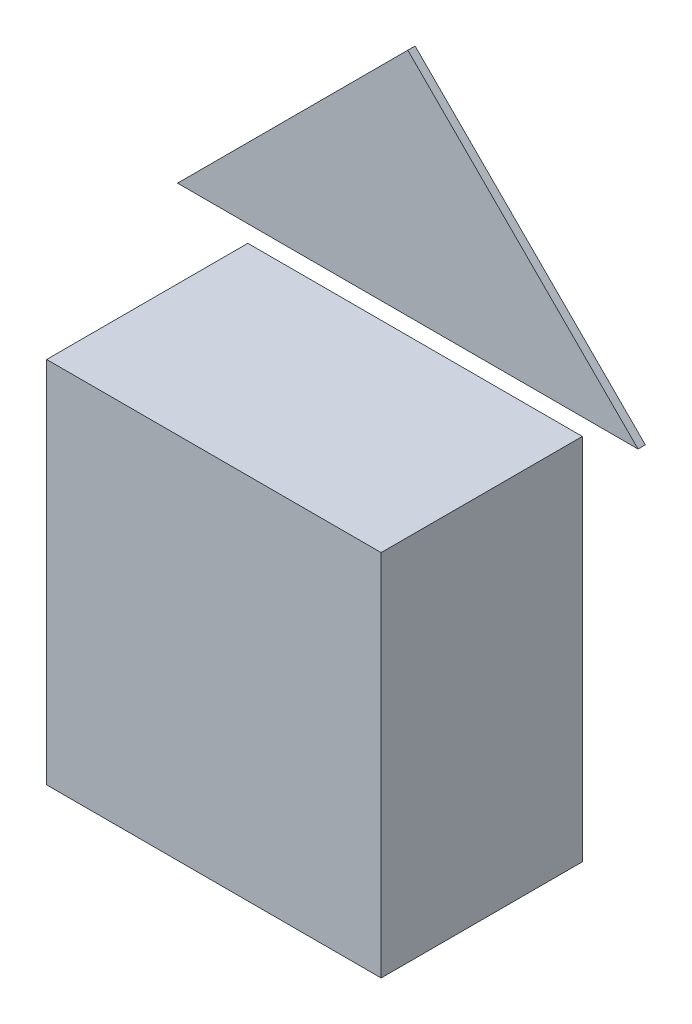
ISO-10303-21;
HEADER;
FILE_DESCRIPTION(('STEP AP214'),'2;1');
FILE_NAME('part.step','',(''),(''),'','','');
FILE_SCHEMA(('AUTOMOTIVE_DESIGN { 1 0 10303 214 1 1 1 1 }'));
ENDSEC;
DATA;
#1=APPLICATION_CONTEXT('core data for automotive mechanical design processes');
#2=APPLICATION_PROTOCOL_DEFINITION('international standard','automotive_design',2000,#1);
#3=PRODUCT_CONTEXT('',#1,'mechanical');
#4=PRODUCT('Part','Part','',(#3));
#5=PRODUCT_RELATED_PRODUCT_CATEGORY('part','',(#4));
#6=PRODUCT_DEFINITION_FORMATION('','',#4);
#7=PRODUCT_DEFINITION_CONTEXT('part definition',#1,'design');
#8=PRODUCT_DEFINITION('design','',#6,#7);
#9=PRODUCT_DEFINITION_SHAPE('','',#8);
#10=(LENGTH_UNIT() NAMED_UNIT(*) SI_UNIT(.MILLI.,.METRE.));
#11=(NAMED_UNIT(*) PLANE_ANGLE_UNIT() SI_UNIT($,.RADIAN.));
#12=(NAMED_UNIT(*) SI_UNIT($,.STERADIAN.) SOLID_ANGLE_UNIT());
#13=UNCERTAINTY_MEASURE_WITH_UNIT(LENGTH_MEASURE(1.E-05),#10,'distance_accuracy_value','');
#14=(GEOMETRIC_REPRESENTATION_CONTEXT(3) GLOBAL_UNCERTAINTY_ASSIGNED_CONTEXT((#13)) GLOBAL_UNIT_ASSIGNED_CONTEXT((#10,
#11,#12)) REPRESENTATION_CONTEXT('',''));
#15=CARTESIAN_POINT('',(0.,0.,0.));
#16=DIRECTION('',(0.,0.,1.));
#17=DIRECTION('',(1.,0.,0.));
#18=AXIS2_PLACEMENT_3D('',#15,#16,#17);
#19=CARTESIAN_POINT('',(973.262557024016,882.440801129921,30.));
#20=DIRECTION('',(-0.707106781186551,-0.707106781186544,0.));
#21=DIRECTION('',(0.707106781186544,-0.707106781186551,0.));
#22=AXIS2_PLACEMENT_3D('',#19,#20,#21);
#23=PLANE('',#22);
#24=DIRECTION('',(-0.707106781186544,0.707106781186551,0.));
#25=VECTOR('',#24,1.);
#26=CARTESIAN_POINT('',(973.262557024016,882.440801129921,0.));
#27=LINE('',#26,#25);
#28=CARTESIAN_POINT('',(973.262557024016,882.440801129921,0.));
#29=VERTEX_POINT('',#28);
#30=CARTESIAN_POINT('',(23.262557024026,1832.44080112992,0.));
#31=VERTEX_POINT('',#30);
#32=EDGE_CURVE('E99',#29,#31,#27,.T.);
#33=ORIENTED_EDGE('',*,*,#32,.T.);
#34=DIRECTION('',(0.,0.,-1.));
#35=VECTOR('',#34,1.);
#36=CARTESIAN_POINT('',(23.262557024026,1832.44080112992,30.));
#37=LINE('',#36,#35);
#38=CARTESIAN_POINT('',(23.262557024026,1832.44080112992,30.));
#39=VERTEX_POINT('',#38);
#40=EDGE_CURVE('E12',#39,#31,#37,.T.);
#41=ORIENTED_EDGE('',*,*,#40,.F.);
#42=DIRECTION('',(-0.707106781186544,0.707106781186551,0.));
#43=VECTOR('',#42,1.);
#44=CARTESIAN_POINT('',(973.262557024016,882.440801129921,30.));
#45=LINE('',#44,#43);
#46=CARTESIAN_POINT('',(973.262557024016,882.440801129921,30.));
#47=VERTEX_POINT('',#46);
#48=EDGE_CURVE('E92',#47,#39,#45,.T.);
#49=ORIENTED_EDGE('',*,*,#48,.F.);
#50=DIRECTION('',(0.,0.,-1.));
#51=VECTOR('',#50,1.);
#52=CARTESIAN_POINT('',(973.262557024016,882.440801129921,30.));
#53=LINE('',#52,#51);
#54=EDGE_CURVE('E100',#47,#29,#53,.T.);
#55=ORIENTED_EDGE('',*,*,#54,.T.);
#56=EDGE_LOOP('',(#33,#41,#49,#55));
#57=FACE_BOUND('',#56,.T.);
#58=ADVANCED_FACE('F52',(#57),#23,.F.);
#59=CARTESIAN_POINT('',(23.262557024026,1832.44080112992,30.));
#60=DIRECTION('',(0.707106781186544,-0.707106781186551,0.));
#61=DIRECTION('',(0.707106781186551,0.707106781186544,0.));
#62=AXIS2_PLACEMENT_3D('',#59,#60,#61);
#63=PLANE('',#62);
#64=DIRECTION('',(-0.707106781186551,-0.707106781186544,0.));
#65=VECTOR('',#64,1.);
#66=CARTESIAN_POINT('',(23.262557024026,1832.44080112992,0.));
#67=LINE('',#66,#65);
#68=CARTESIAN_POINT('',(-926.737442975983,882.440801129921,0.));
#69=VERTEX_POINT('',#68);
#70=EDGE_CURVE('E80',#31,#69,#67,.T.);
#71=ORIENTED_EDGE('',*,*,#70,.T.);
#72=DIRECTION('',(0.,0.,-1.));
#73=VECTOR('',#72,1.);
#74=CARTESIAN_POINT('',(-926.737442975983,882.440801129921,30.));
#75=LINE('',#74,#73);
#76=CARTESIAN_POINT('',(-926.737442975983,882.440801129921,30.));
#77=VERTEX_POINT('',#76);
#78=EDGE_CURVE('E60',#77,#69,#75,.T.);
#79=ORIENTED_EDGE('',*,*,#78,.F.);
#80=DIRECTION('',(-0.707106781186551,-0.707106781186544,0.));
#81=VECTOR('',#80,1.);
#82=CARTESIAN_POINT('',(23.262557024026,1832.44080112992,30.));
#83=LINE('',#82,#81);
#84=EDGE_CURVE('E88',#39,#77,#83,.T.);
#85=ORIENTED_EDGE('',*,*,#84,.F.);
#86=ORIENTED_EDGE('',*,*,#40,.T.);
#87=EDGE_LOOP('',(#71,#79,#85,#86));
#88=FACE_BOUND('',#87,.T.);
#89=ADVANCED_FACE('F89',(#88),#63,.F.);
#90=CARTESIAN_POINT('',(-926.737442975983,882.440801129921,30.));
#91=DIRECTION('',(0.,1.,0.));
#92=DIRECTION('',(-1.,0.,0.));
#93=AXIS2_PLACEMENT_3D('',#90,#91,#92);
#94=PLANE('',#93);
#95=DIRECTION('',(1.,0.,0.));
#96=VECTOR('',#95,1.);
#97=CARTESIAN_POINT('',(-926.737442975983,882.440801129921,0.));
#98=LINE('',#97,#96);
#99=EDGE_CURVE('E85',#69,#29,#98,.T.);
#100=ORIENTED_EDGE('',*,*,#99,.T.);
#101=ORIENTED_EDGE('',*,*,#54,.F.);
#102=DIRECTION('',(1.,0.,0.));
#103=VECTOR('',#102,1.);
#104=CARTESIAN_POINT('',(-926.737442975983,882.440801129921,30.));
#105=LINE('',#104,#103);
#106=EDGE_CURVE('E68',#77,#47,#105,.T.);
#107=ORIENTED_EDGE('',*,*,#106,.F.);
#108=ORIENTED_EDGE('',*,*,#78,.T.);
#109=EDGE_LOOP('',(#100,#101,#107,#108));
#110=FACE_BOUND('',#109,.T.);
#111=ADVANCED_FACE('F107',(#110),#94,.F.);
#112=CARTESIAN_POINT('',(0.,0.,30.));
#113=DIRECTION('',(0.,0.,1.));
#114=DIRECTION('',(1.,0.,0.));
#115=AXIS2_PLACEMENT_3D('',#112,#113,#114);
#116=PLANE('',#115);
#117=ORIENTED_EDGE('',*,*,#48,.T.);
#118=ORIENTED_EDGE('',*,*,#84,.T.);
#119=ORIENTED_EDGE('',*,*,#106,.T.);
#120=EDGE_LOOP('',(#117,#118,#119));
#121=FACE_BOUND('',#120,.T.);
#122=ADVANCED_FACE('F95',(#121),#116,.T.);
#123=CARTESIAN_POINT('',(0.,0.,0.));
#124=DIRECTION('',(0.,0.,1.));
#125=DIRECTION('',(1.,0.,0.));
#126=AXIS2_PLACEMENT_3D('',#123,#124,#125);
#127=PLANE('',#126);
#128=ORIENTED_EDGE('',*,*,#32,.F.);
#129=ORIENTED_EDGE('',*,*,#99,.F.);
#130=ORIENTED_EDGE('',*,*,#70,.F.);
#131=EDGE_LOOP('',(#128,#129,#130));
#132=FACE_BOUND('',#131,.T.);
#133=ADVANCED_FACE('F108',(#132),#127,.F.);
#134=CLOSED_SHELL('',(#58,#89,#111,#122,#133));
#135=MANIFOLD_SOLID_BREP('B2',#134);
#136=CARTESIAN_POINT('',(-666.737442975974,782.440801129921,830.));
#137=DIRECTION('',(0.,1.,0.));
#138=DIRECTION('',(-1.,0.,0.));
#139=AXIS2_PLACEMENT_3D('',#136,#137,#138);
#140=PLANE('',#139);
#141=DIRECTION('',(1.,0.,0.));
#142=VECTOR('',#141,1.);
#143=CARTESIAN_POINT('',(-666.737442975974,782.440801129921,0.));
#144=LINE('',#143,#142);
#145=CARTESIAN_POINT('',(-666.737442975974,782.440801129921,0.));
#146=VERTEX_POINT('',#145);
#147=CARTESIAN_POINT('',(713.262557024026,782.440801129921,0.));
#148=VERTEX_POINT('',#147);
#149=EDGE_CURVE('E230',#146,#148,#144,.T.);
#150=ORIENTED_EDGE('',*,*,#149,.F.);
#151=DIRECTION('',(0.,0.,-1.));
#152=VECTOR('',#151,1.);
#153=CARTESIAN_POINT('',(-666.737442975974,782.440801129921,830.));
#154=LINE('',#153,#152);
#155=CARTESIAN_POINT('',(-666.737442975974,782.440801129921,830.));
#156=VERTEX_POINT('',#155);
#157=EDGE_CURVE('E50',#156,#146,#154,.T.);
#158=ORIENTED_EDGE('',*,*,#157,.F.);
#159=DIRECTION('',(1.,0.,0.));
#160=VECTOR('',#159,1.);
#161=CARTESIAN_POINT('',(-666.737442975974,782.440801129921,830.));
#162=LINE('',#161,#160);
#163=CARTESIAN_POINT('',(713.262557024026,782.440801129921,830.));
#164=VERTEX_POINT('',#163);
#165=EDGE_CURVE('E223',#156,#164,#162,.T.);
#166=ORIENTED_EDGE('',*,*,#165,.T.);
#167=DIRECTION('',(0.,0.,-1.));
#168=VECTOR('',#167,1.);
#169=CARTESIAN_POINT('',(713.262557024026,782.440801129921,830.));
#170=LINE('',#169,#168);
#171=EDGE_CURVE('E162',#164,#148,#170,.T.);
#172=ORIENTED_EDGE('',*,*,#171,.T.);
#173=EDGE_LOOP('',(#150,#158,#166,#172));
#174=FACE_BOUND('',#173,.T.);
#175=ADVANCED_FACE('F159',(#174),#140,.T.);
#176=CARTESIAN_POINT('',(-666.737442975974,782.440801129921,830.));
#177=DIRECTION('',(1.,0.,0.));
#178=DIRECTION('',(0.,1.,0.));
#179=AXIS2_PLACEMENT_3D('',#176,#177,#178);
#180=PLANE('',#179);
#181=DIRECTION('',(0.,-1.,0.));
#182=VECTOR('',#181,1.);
#183=CARTESIAN_POINT('',(-666.737442975974,782.440801129921,0.));
#184=LINE('',#183,#182);
#185=CARTESIAN_POINT('',(-666.737442975974,-737.559198870079,0.));
#186=VERTEX_POINT('',#185);
#187=EDGE_CURVE('E193',#146,#186,#184,.T.);
#188=ORIENTED_EDGE('',*,*,#187,.T.);
#189=DIRECTION('',(0.,0.,-1.));
#190=VECTOR('',#189,1.);
#191=CARTESIAN_POINT('',(-666.737442975974,-737.559198870079,830.));
#192=LINE('',#191,#190);
#193=CARTESIAN_POINT('',(-666.737442975974,-737.559198870079,830.));
#194=VERTEX_POINT('',#193);
#195=EDGE_CURVE('E169',#194,#186,#192,.T.);
#196=ORIENTED_EDGE('',*,*,#195,.F.);
#197=DIRECTION('',(0.,-1.,0.));
#198=VECTOR('',#197,1.);
#199=CARTESIAN_POINT('',(-666.737442975974,782.440801129921,830.));
#200=LINE('',#199,#198);
#201=EDGE_CURVE('E210',#156,#194,#200,.T.);
#202=ORIENTED_EDGE('',*,*,#201,.F.);
#203=ORIENTED_EDGE('',*,*,#157,.T.);
#204=EDGE_LOOP('',(#188,#196,#202,#203));
#205=FACE_BOUND('',#204,.T.);
#206=ADVANCED_FACE('F246',(#205),#180,.F.);
#207=CARTESIAN_POINT('',(-666.737442975974,-737.559198870079,830.));
#208=DIRECTION('',(0.,1.,0.));
#209=DIRECTION('',(0.,0.,1.));
#210=AXIS2_PLACEMENT_3D('',#207,#208,#209);
#211=PLANE('',#210);
#212=DIRECTION('',(1.,0.,0.));
#213=VECTOR('',#212,1.);
#214=CARTESIAN_POINT('',(-666.737442975974,-737.559198870079,0.));
#215=LINE('',#214,#213);
#216=CARTESIAN_POINT('',(713.262557024026,-737.559198870079,0.));
#217=VERTEX_POINT('',#216);
#218=EDGE_CURVE('E218',#186,#217,#215,.T.);
#219=ORIENTED_EDGE('',*,*,#218,.T.);
#220=DIRECTION('',(0.,0.,-1.));
#221=VECTOR('',#220,1.);
#222=CARTESIAN_POINT('',(713.262557024026,-737.559198870079,830.));
#223=LINE('',#222,#221);
#224=CARTESIAN_POINT('',(713.262557024026,-737.559198870079,830.));
#225=VERTEX_POINT('',#224);
#226=EDGE_CURVE('E215',#225,#217,#223,.T.);
#227=ORIENTED_EDGE('',*,*,#226,.F.);
#228=DIRECTION('',(1.,0.,0.));
#229=VECTOR('',#228,1.);
#230=CARTESIAN_POINT('',(-666.737442975974,-737.559198870079,830.));
#231=LINE('',#230,#229);
#232=EDGE_CURVE('E205',#194,#225,#231,.T.);
#233=ORIENTED_EDGE('',*,*,#232,.F.);
#234=ORIENTED_EDGE('',*,*,#195,.T.);
#235=EDGE_LOOP('',(#219,#227,#233,#234));
#236=FACE_BOUND('',#235,.T.);
#237=ADVANCED_FACE('F216',(#236),#211,.F.);
#238=CARTESIAN_POINT('',(713.262557024026,782.440801129921,830.));
#239=DIRECTION('',(1.,0.,0.));
#240=DIRECTION('',(0.,1.,0.));
#241=AXIS2_PLACEMENT_3D('',#238,#239,#240);
#242=PLANE('',#241);
#243=DIRECTION('',(0.,-1.,0.));
#244=VECTOR('',#243,1.);
#245=CARTESIAN_POINT('',(713.262557024026,782.440801129921,0.));
#246=LINE('',#245,#244);
#247=EDGE_CURVE('E234',#148,#217,#246,.T.);
#248=ORIENTED_EDGE('',*,*,#247,.F.);
#249=ORIENTED_EDGE('',*,*,#171,.F.);
#250=DIRECTION('',(0.,-1.,0.));
#251=VECTOR('',#250,1.);
#252=CARTESIAN_POINT('',(713.262557024026,782.440801129921,830.));
#253=LINE('',#252,#251);
#254=EDGE_CURVE('E209',#164,#225,#253,.T.);
#255=ORIENTED_EDGE('',*,*,#254,.T.);
#256=ORIENTED_EDGE('',*,*,#226,.T.);
#257=EDGE_LOOP('',(#248,#249,#255,#256));
#258=FACE_BOUND('',#257,.T.);
#259=ADVANCED_FACE('F221',(#258),#242,.T.);
#260=CARTESIAN_POINT('',(0.,0.,830.));
#261=DIRECTION('',(0.,0.,-1.));
#262=DIRECTION('',(-1.,0.,0.));
#263=AXIS2_PLACEMENT_3D('',#260,#261,#262);
#264=PLANE('',#263);
#265=ORIENTED_EDGE('',*,*,#165,.F.);
#266=ORIENTED_EDGE('',*,*,#201,.T.);
#267=ORIENTED_EDGE('',*,*,#232,.T.);
#268=ORIENTED_EDGE('',*,*,#254,.F.);
#269=EDGE_LOOP('',(#265,#266,#267,#268));
#270=FACE_BOUND('',#269,.T.);
#271=ADVANCED_FACE('F208',(#270),#264,.F.);
#272=CARTESIAN_POINT('',(0.,0.,0.));
#273=DIRECTION('',(0.,0.,-1.));
#274=DIRECTION('',(-1.,0.,0.));
#275=AXIS2_PLACEMENT_3D('',#272,#273,#274);
#276=PLANE('',#275);
#277=ORIENTED_EDGE('',*,*,#149,.T.);
#278=ORIENTED_EDGE('',*,*,#247,.T.);
#279=ORIENTED_EDGE('',*,*,#218,.F.);
#280=ORIENTED_EDGE('',*,*,#187,.F.);
#281=EDGE_LOOP('',(#277,#278,#279,#280));
#282=FACE_BOUND('',#281,.T.);
#283=ADVANCED_FACE('F243',(#282),#276,.T.);
#284=CLOSED_SHELL('',(#175,#206,#237,#259,#271,#283));
#285=MANIFOLD_SOLID_BREP('B6',#284);
#286=ADVANCED_BREP_SHAPE_REPRESENTATION('',(#18,#135,#285),#14);
#287=SHAPE_DEFINITION_REPRESENTATION(#9,#286);
ENDSEC;
END-ISO-10303-21;
